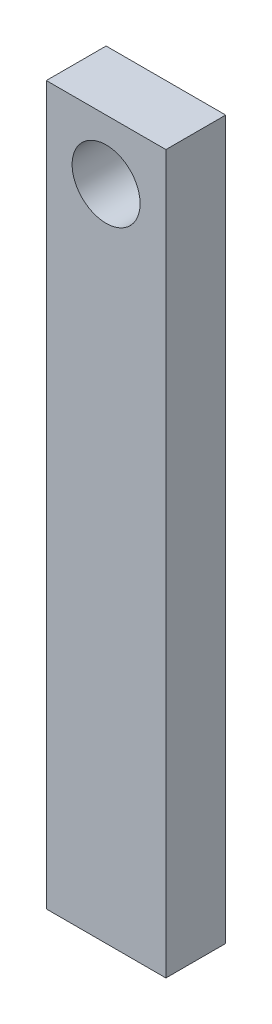
ISO-10303-21;
HEADER;
FILE_DESCRIPTION(('STEP AP214'),'2;1');
FILE_NAME('part.step','',(''),(''),'','','');
FILE_SCHEMA(('AUTOMOTIVE_DESIGN { 1 0 10303 214 1 1 1 1 }'));
ENDSEC;
DATA;
#1=APPLICATION_CONTEXT('core data for automotive mechanical design processes');
#2=APPLICATION_PROTOCOL_DEFINITION('international standard','automotive_design',2000,#1);
#3=PRODUCT_CONTEXT('',#1,'mechanical');
#4=PRODUCT('Part','Part','',(#3));
#5=PRODUCT_RELATED_PRODUCT_CATEGORY('part','',(#4));
#6=PRODUCT_DEFINITION_FORMATION('','',#4);
#7=PRODUCT_DEFINITION_CONTEXT('part definition',#1,'design');
#8=PRODUCT_DEFINITION('design','',#6,#7);
#9=PRODUCT_DEFINITION_SHAPE('','',#8);
#10=(LENGTH_UNIT() NAMED_UNIT(*) SI_UNIT(.MILLI.,.METRE.));
#11=(NAMED_UNIT(*) PLANE_ANGLE_UNIT() SI_UNIT($,.RADIAN.));
#12=(NAMED_UNIT(*) SI_UNIT($,.STERADIAN.) SOLID_ANGLE_UNIT());
#13=UNCERTAINTY_MEASURE_WITH_UNIT(LENGTH_MEASURE(1.E-05),#10,'distance_accuracy_value','');
#14=(GEOMETRIC_REPRESENTATION_CONTEXT(3) GLOBAL_UNCERTAINTY_ASSIGNED_CONTEXT((#13)) GLOBAL_UNIT_ASSIGNED_CONTEXT((#10,
#11,#12)) REPRESENTATION_CONTEXT('',''));
#15=CARTESIAN_POINT('',(0.,0.,0.));
#16=DIRECTION('',(0.,0.,1.));
#17=DIRECTION('',(1.,0.,0.));
#18=AXIS2_PLACEMENT_3D('',#15,#16,#17);
#19=CARTESIAN_POINT('',(0.,0.,25.4));
#20=DIRECTION('',(0.,0.,-1.));
#21=DIRECTION('',(-1.,0.,0.));
#22=AXIS2_PLACEMENT_3D('',#19,#20,#21);
#23=PLANE('',#22);
#24=DIRECTION('',(0.,-1.,0.));
#25=VECTOR('',#24,1.);
#26=CARTESIAN_POINT('',(-59.5985523652744,0.,25.4));
#27=LINE('',#26,#25);
#28=CARTESIAN_POINT('',(-59.5985523652744,304.8,25.4));
#29=VERTEX_POINT('',#28);
#30=CARTESIAN_POINT('',(-59.5985523652744,0.,25.4));
#31=VERTEX_POINT('',#30);
#32=EDGE_CURVE('E84',#29,#31,#27,.T.);
#33=ORIENTED_EDGE('',*,*,#32,.T.);
#34=DIRECTION('',(1.,0.,0.));
#35=VECTOR('',#34,1.);
#36=CARTESIAN_POINT('',(-59.5985523652744,0.,25.4));
#37=LINE('',#36,#35);
#38=CARTESIAN_POINT('',(-8.79855236527435,0.,25.4));
#39=VERTEX_POINT('',#38);
#40=EDGE_CURVE('E78',#31,#39,#37,.T.);
#41=ORIENTED_EDGE('',*,*,#40,.T.);
#42=DIRECTION('',(0.,1.,0.));
#43=VECTOR('',#42,1.);
#44=CARTESIAN_POINT('',(-8.79855236527435,0.,25.4));
#45=LINE('',#44,#43);
#46=CARTESIAN_POINT('',(-8.79855236527437,304.8,25.4));
#47=VERTEX_POINT('',#46);
#48=EDGE_CURVE('E81',#39,#47,#45,.T.);
#49=ORIENTED_EDGE('',*,*,#48,.T.);
#50=DIRECTION('',(-1.,0.,0.));
#51=VECTOR('',#50,1.);
#52=CARTESIAN_POINT('',(-34.1985523652744,304.8,25.4));
#53=LINE('',#52,#51);
#54=EDGE_CURVE('E50',#47,#29,#53,.T.);
#55=ORIENTED_EDGE('',*,*,#54,.T.);
#56=EDGE_LOOP('',(#33,#41,#49,#55));
#57=FACE_BOUND('',#56,.T.);
#58=CARTESIAN_POINT('',(-34.1985523652744,279.4,25.4));
#59=DIRECTION('',(0.,0.,1.));
#60=DIRECTION('',(1.,0.,0.));
#61=AXIS2_PLACEMENT_3D('',#58,#59,#60);
#62=CIRCLE('',#61,14.4382974444707);
#63=CARTESIAN_POINT('',(-19.7602549208037,279.4,25.4));
#64=VERTEX_POINT('',#63);
#65=EDGE_CURVE('E101',#64,#64,#62,.T.);
#66=ORIENTED_EDGE('',*,*,#65,.F.);
#67=EDGE_LOOP('',(#66));
#68=FACE_BOUND('',#67,.T.);
#69=ADVANCED_FACE('F33',(#57,#68),#23,.F.);
#70=CARTESIAN_POINT('',(0.,0.,0.));
#71=DIRECTION('',(0.,0.,-1.));
#72=DIRECTION('',(-1.,0.,0.));
#73=AXIS2_PLACEMENT_3D('',#70,#71,#72);
#74=PLANE('',#73);
#75=DIRECTION('',(0.,-1.,0.));
#76=VECTOR('',#75,1.);
#77=CARTESIAN_POINT('',(-59.5985523652744,0.,0.));
#78=LINE('',#77,#76);
#79=CARTESIAN_POINT('',(-59.5985523652744,304.8,0.));
#80=VERTEX_POINT('',#79);
#81=CARTESIAN_POINT('',(-59.5985523652744,0.,0.));
#82=VERTEX_POINT('',#81);
#83=EDGE_CURVE('E98',#80,#82,#78,.T.);
#84=ORIENTED_EDGE('',*,*,#83,.F.);
#85=DIRECTION('',(-1.,0.,0.));
#86=VECTOR('',#85,1.);
#87=CARTESIAN_POINT('',(-59.5985523652744,304.8,0.));
#88=LINE('',#87,#86);
#89=CARTESIAN_POINT('',(-8.79855236527437,304.8,0.));
#90=VERTEX_POINT('',#89);
#91=EDGE_CURVE('E67',#90,#80,#88,.T.);
#92=ORIENTED_EDGE('',*,*,#91,.F.);
#93=DIRECTION('',(0.,1.,0.));
#94=VECTOR('',#93,1.);
#95=CARTESIAN_POINT('',(-8.79855236527435,0.,0.));
#96=LINE('',#95,#94);
#97=CARTESIAN_POINT('',(-8.79855236527435,0.,0.));
#98=VERTEX_POINT('',#97);
#99=EDGE_CURVE('E103',#98,#90,#96,.T.);
#100=ORIENTED_EDGE('',*,*,#99,.F.);
#101=DIRECTION('',(1.,0.,0.));
#102=VECTOR('',#101,1.);
#103=CARTESIAN_POINT('',(-59.5985523652744,0.,0.));
#104=LINE('',#103,#102);
#105=EDGE_CURVE('E89',#82,#98,#104,.T.);
#106=ORIENTED_EDGE('',*,*,#105,.F.);
#107=EDGE_LOOP('',(#84,#92,#100,#106));
#108=FACE_BOUND('',#107,.T.);
#109=CARTESIAN_POINT('',(-34.1985523652744,279.4,0.));
#110=DIRECTION('',(0.,0.,1.));
#111=DIRECTION('',(1.,0.,0.));
#112=AXIS2_PLACEMENT_3D('',#109,#110,#111);
#113=CIRCLE('',#112,14.4382974444707);
#114=CARTESIAN_POINT('',(-19.7602549208037,279.4,0.));
#115=VERTEX_POINT('',#114);
#116=EDGE_CURVE('E110',#115,#115,#113,.T.);
#117=ORIENTED_EDGE('',*,*,#116,.T.);
#118=EDGE_LOOP('',(#117));
#119=FACE_BOUND('',#118,.T.);
#120=ADVANCED_FACE('F119',(#108,#119),#74,.T.);
#121=CARTESIAN_POINT('',(-59.5985523652744,0.,25.4));
#122=DIRECTION('',(1.,0.,0.));
#123=DIRECTION('',(0.,1.,0.));
#124=AXIS2_PLACEMENT_3D('',#121,#122,#123);
#125=PLANE('',#124);
#126=ORIENTED_EDGE('',*,*,#83,.T.);
#127=DIRECTION('',(0.,0.,-1.));
#128=VECTOR('',#127,1.);
#129=CARTESIAN_POINT('',(-59.5985523652744,0.,25.4));
#130=LINE('',#129,#128);
#131=EDGE_CURVE('E11',#31,#82,#130,.T.);
#132=ORIENTED_EDGE('',*,*,#131,.F.);
#133=ORIENTED_EDGE('',*,*,#32,.F.);
#134=DIRECTION('',(0.,0.,-1.));
#135=VECTOR('',#134,1.);
#136=CARTESIAN_POINT('',(-59.5985523652744,304.8,25.4));
#137=LINE('',#136,#135);
#138=EDGE_CURVE('E94',#29,#80,#137,.T.);
#139=ORIENTED_EDGE('',*,*,#138,.T.);
#140=EDGE_LOOP('',(#126,#132,#133,#139));
#141=FACE_BOUND('',#140,.T.);
#142=ADVANCED_FACE('F35',(#141),#125,.F.);
#143=CARTESIAN_POINT('',(-59.5985523652744,0.,25.4));
#144=DIRECTION('',(0.,1.,0.));
#145=DIRECTION('',(0.,0.,1.));
#146=AXIS2_PLACEMENT_3D('',#143,#144,#145);
#147=PLANE('',#146);
#148=ORIENTED_EDGE('',*,*,#105,.T.);
#149=DIRECTION('',(0.,0.,-1.));
#150=VECTOR('',#149,1.);
#151=CARTESIAN_POINT('',(-8.79855236527435,0.,25.4));
#152=LINE('',#151,#150);
#153=EDGE_CURVE('E42',#39,#98,#152,.T.);
#154=ORIENTED_EDGE('',*,*,#153,.F.);
#155=ORIENTED_EDGE('',*,*,#40,.F.);
#156=ORIENTED_EDGE('',*,*,#131,.T.);
#157=EDGE_LOOP('',(#148,#154,#155,#156));
#158=FACE_BOUND('',#157,.T.);
#159=ADVANCED_FACE('F88',(#158),#147,.F.);
#160=CARTESIAN_POINT('',(-8.79855236527435,0.,25.4));
#161=DIRECTION('',(-1.,0.,0.));
#162=DIRECTION('',(0.,-1.,0.));
#163=AXIS2_PLACEMENT_3D('',#160,#161,#162);
#164=PLANE('',#163);
#165=ORIENTED_EDGE('',*,*,#99,.T.);
#166=DIRECTION('',(0.,0.,-1.));
#167=VECTOR('',#166,1.);
#168=CARTESIAN_POINT('',(-8.79855236527437,304.8,25.4));
#169=LINE('',#168,#167);
#170=EDGE_CURVE('E91',#47,#90,#169,.T.);
#171=ORIENTED_EDGE('',*,*,#170,.F.);
#172=ORIENTED_EDGE('',*,*,#48,.F.);
#173=ORIENTED_EDGE('',*,*,#153,.T.);
#174=EDGE_LOOP('',(#165,#171,#172,#173));
#175=FACE_BOUND('',#174,.T.);
#176=ADVANCED_FACE('F92',(#175),#164,.F.);
#177=CARTESIAN_POINT('',(-59.5985523652744,304.8,25.4));
#178=DIRECTION('',(0.,-1.,0.));
#179=DIRECTION('',(0.,0.,-1.));
#180=AXIS2_PLACEMENT_3D('',#177,#178,#179);
#181=PLANE('',#180);
#182=ORIENTED_EDGE('',*,*,#91,.T.);
#183=ORIENTED_EDGE('',*,*,#138,.F.);
#184=ORIENTED_EDGE('',*,*,#54,.F.);
#185=ORIENTED_EDGE('',*,*,#170,.T.);
#186=EDGE_LOOP('',(#182,#183,#184,#185));
#187=FACE_BOUND('',#186,.T.);
#188=ADVANCED_FACE('F107',(#187),#181,.F.);
#189=CARTESIAN_POINT('',(-34.1985523652744,279.4,25.4));
#190=DIRECTION('',(0.,0.,-1.));
#191=DIRECTION('',(-1.,0.,0.));
#192=AXIS2_PLACEMENT_3D('',#189,#190,#191);
#193=CYLINDRICAL_SURFACE('',#192,14.4382974444707);
#194=ORIENTED_EDGE('',*,*,#65,.T.);
#195=EDGE_LOOP('',(#194));
#196=FACE_BOUND('',#195,.T.);
#197=ORIENTED_EDGE('',*,*,#116,.F.);
#198=EDGE_LOOP('',(#197));
#199=FACE_BOUND('',#198,.T.);
#200=ADVANCED_FACE('F116',(#196,#199),#193,.F.);
#201=CLOSED_SHELL('',(#69,#120,#142,#159,#176,#188,#200));
#202=MANIFOLD_SOLID_BREP('B2',#201);
#203=ADVANCED_BREP_SHAPE_REPRESENTATION('',(#18,#202),#14);
#204=SHAPE_DEFINITION_REPRESENTATION(#9,#203);
ENDSEC;
END-ISO-10303-21;
